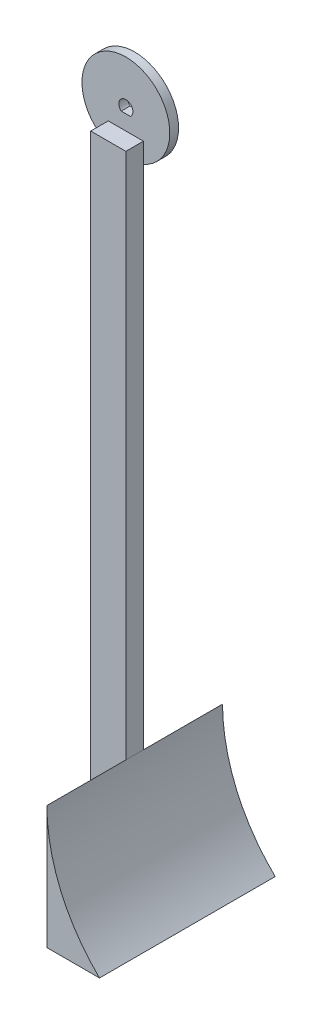
ISO-10303-21;
HEADER;
FILE_DESCRIPTION(('STEP AP214'),'2;1');
FILE_NAME('part.step','',(''),(''),'','','');
FILE_SCHEMA(('AUTOMOTIVE_DESIGN { 1 0 10303 214 1 1 1 1 }'));
ENDSEC;
DATA;
#1=APPLICATION_CONTEXT('core data for automotive mechanical design processes');
#2=APPLICATION_PROTOCOL_DEFINITION('international standard','automotive_design',2000,#1);
#3=PRODUCT_CONTEXT('',#1,'mechanical');
#4=PRODUCT('Part','Part','',(#3));
#5=PRODUCT_RELATED_PRODUCT_CATEGORY('part','',(#4));
#6=PRODUCT_DEFINITION_FORMATION('','',#4);
#7=PRODUCT_DEFINITION_CONTEXT('part definition',#1,'design');
#8=PRODUCT_DEFINITION('design','',#6,#7);
#9=PRODUCT_DEFINITION_SHAPE('','',#8);
#10=(LENGTH_UNIT() NAMED_UNIT(*) SI_UNIT(.MILLI.,.METRE.));
#11=(NAMED_UNIT(*) PLANE_ANGLE_UNIT() SI_UNIT($,.RADIAN.));
#12=(NAMED_UNIT(*) SI_UNIT($,.STERADIAN.) SOLID_ANGLE_UNIT());
#13=UNCERTAINTY_MEASURE_WITH_UNIT(LENGTH_MEASURE(1.E-05),#10,'distance_accuracy_value','');
#14=(GEOMETRIC_REPRESENTATION_CONTEXT(3) GLOBAL_UNCERTAINTY_ASSIGNED_CONTEXT((#13)) GLOBAL_UNIT_ASSIGNED_CONTEXT((#10,
#11,#12)) REPRESENTATION_CONTEXT('',''));
#15=CARTESIAN_POINT('',(0.,0.,0.));
#16=DIRECTION('',(0.,0.,1.));
#17=DIRECTION('',(1.,0.,0.));
#18=AXIS2_PLACEMENT_3D('',#15,#16,#17);
#19=CARTESIAN_POINT('',(5.,0.,0.));
#20=DIRECTION('',(1.,0.,0.));
#21=DIRECTION('',(0.,1.,0.));
#22=AXIS2_PLACEMENT_3D('',#19,#20,#21);
#23=PLANE('',#22);
#24=DIRECTION('',(0.,1.,0.));
#25=VECTOR('',#24,1.);
#26=CARTESIAN_POINT('',(5.,0.,7.5));
#27=LINE('',#26,#25);
#28=CARTESIAN_POINT('',(5.,-190.754430390358,7.5));
#29=VERTEX_POINT('',#28);
#30=CARTESIAN_POINT('',(5.00000000000002,-155.754430390358,7.49999999999999));
#31=VERTEX_POINT('',#30);
#32=EDGE_CURVE('E175',#29,#31,#27,.T.);
#33=ORIENTED_EDGE('',*,*,#32,.F.);
#34=DIRECTION('',(0.,0.,1.));
#35=VECTOR('',#34,1.);
#36=CARTESIAN_POINT('',(5.00000000000002,-190.754430390358,0.));
#37=LINE('',#36,#35);
#38=CARTESIAN_POINT('',(5.00000000000002,-190.754430390358,30.));
#39=VERTEX_POINT('',#38);
#40=EDGE_CURVE('E165',#29,#39,#37,.T.);
#41=ORIENTED_EDGE('',*,*,#40,.T.);
#42=DIRECTION('',(0.,-1.,0.));
#43=VECTOR('',#42,1.);
#44=CARTESIAN_POINT('',(5.,0.,30.));
#45=LINE('',#44,#43);
#46=CARTESIAN_POINT('',(5.00000000000002,-155.754430390358,30.));
#47=VERTEX_POINT('',#46);
#48=EDGE_CURVE('E308',#47,#39,#45,.T.);
#49=ORIENTED_EDGE('',*,*,#48,.F.);
#50=DIRECTION('',(0.,0.,-1.));
#51=VECTOR('',#50,1.);
#52=CARTESIAN_POINT('',(5.00000000000002,-155.754430390358,0.));
#53=LINE('',#52,#51);
#54=EDGE_CURVE('E155',#47,#31,#53,.T.);
#55=ORIENTED_EDGE('',*,*,#54,.T.);
#56=EDGE_LOOP('',(#33,#41,#49,#55));
#57=FACE_BOUND('',#56,.T.);
#58=ADVANCED_FACE('F47',(#57),#23,.F.);
#59=CARTESIAN_POINT('',(0.,0.,2.5));
#60=DIRECTION('',(0.,0.,-1.));
#61=DIRECTION('',(-1.,0.,0.));
#62=AXIS2_PLACEMENT_3D('',#59,#60,#61);
#63=CYLINDRICAL_SURFACE('',#62,2.);
#64=CARTESIAN_POINT('',(0.,0.,0.));
#65=DIRECTION('',(0.,0.,1.));
#66=DIRECTION('',(1.,0.,0.));
#67=AXIS2_PLACEMENT_3D('',#64,#65,#66);
#68=CIRCLE('',#67,2.);
#69=CARTESIAN_POINT('',(1.3228756555323,-1.5,0.));
#70=VERTEX_POINT('',#69);
#71=CARTESIAN_POINT('',(-1.3228756555323,-1.5,0.));
#72=VERTEX_POINT('',#71);
#73=EDGE_CURVE('E201',#70,#72,#68,.T.);
#74=ORIENTED_EDGE('',*,*,#73,.F.);
#75=DIRECTION('',(0.,0.,-1.));
#76=VECTOR('',#75,1.);
#77=CARTESIAN_POINT('',(1.3228756555323,-1.5,2.5));
#78=LINE('',#77,#76);
#79=CARTESIAN_POINT('',(1.3228756555323,-1.5,2.5));
#80=VERTEX_POINT('',#79);
#81=EDGE_CURVE('E51',#80,#70,#78,.T.);
#82=ORIENTED_EDGE('',*,*,#81,.F.);
#83=CARTESIAN_POINT('',(0.,0.,2.5));
#84=DIRECTION('',(0.,0.,1.));
#85=DIRECTION('',(1.,0.,0.));
#86=AXIS2_PLACEMENT_3D('',#83,#84,#85);
#87=CIRCLE('',#86,2.);
#88=CARTESIAN_POINT('',(-1.3228756555323,-1.5,2.5));
#89=VERTEX_POINT('',#88);
#90=EDGE_CURVE('E202',#80,#89,#87,.T.);
#91=ORIENTED_EDGE('',*,*,#90,.T.);
#92=DIRECTION('',(0.,0.,-1.));
#93=VECTOR('',#92,1.);
#94=CARTESIAN_POINT('',(-1.3228756555323,-1.5,2.5));
#95=LINE('',#94,#93);
#96=EDGE_CURVE('E216',#89,#72,#95,.T.);
#97=ORIENTED_EDGE('',*,*,#96,.T.);
#98=EDGE_LOOP('',(#74,#82,#91,#97));
#99=FACE_BOUND('',#98,.T.);
#100=ADVANCED_FACE('F49',(#99),#63,.F.);
#101=CARTESIAN_POINT('',(0.,-1.5,2.5));
#102=DIRECTION('',(0.,1.,0.));
#103=DIRECTION('',(0.,0.,1.));
#104=AXIS2_PLACEMENT_3D('',#101,#102,#103);
#105=PLANE('',#104);
#106=DIRECTION('',(1.,0.,0.));
#107=VECTOR('',#106,1.);
#108=CARTESIAN_POINT('',(0.,-1.5,0.));
#109=LINE('',#108,#107);
#110=EDGE_CURVE('E220',#72,#70,#109,.T.);
#111=ORIENTED_EDGE('',*,*,#110,.F.);
#112=ORIENTED_EDGE('',*,*,#96,.F.);
#113=DIRECTION('',(1.,0.,0.));
#114=VECTOR('',#113,1.);
#115=CARTESIAN_POINT('',(0.,-1.5,2.5));
#116=LINE('',#115,#114);
#117=EDGE_CURVE('E206',#89,#80,#116,.T.);
#118=ORIENTED_EDGE('',*,*,#117,.T.);
#119=ORIENTED_EDGE('',*,*,#81,.T.);
#120=EDGE_LOOP('',(#111,#112,#118,#119));
#121=FACE_BOUND('',#120,.T.);
#122=ADVANCED_FACE('F232',(#121),#105,.T.);
#123=CARTESIAN_POINT('',(0.,0.,2.5));
#124=DIRECTION('',(0.,0.,-1.));
#125=DIRECTION('',(-1.,0.,0.));
#126=AXIS2_PLACEMENT_3D('',#123,#124,#125);
#127=CYLINDRICAL_SURFACE('',#126,12.5);
#128=CARTESIAN_POINT('',(0.,0.,2.5));
#129=DIRECTION('',(0.,0.,1.));
#130=DIRECTION('',(1.,0.,0.));
#131=AXIS2_PLACEMENT_3D('',#128,#129,#130);
#132=CIRCLE('',#131,12.5);
#133=CARTESIAN_POINT('',(-5.,-11.4564392373896,2.5));
#134=VERTEX_POINT('',#133);
#135=CARTESIAN_POINT('',(5.,-11.4564392373896,2.5));
#136=VERTEX_POINT('',#135);
#137=EDGE_CURVE('E212',#134,#136,#132,.T.);
#138=ORIENTED_EDGE('',*,*,#137,.F.);
#139=EDGE_CURVE('E211',#136,#134,#132,.T.);
#140=ORIENTED_EDGE('',*,*,#139,.F.);
#141=EDGE_LOOP('',(#138,#140));
#142=FACE_BOUND('',#141,.T.);
#143=CARTESIAN_POINT('',(0.,0.,0.));
#144=DIRECTION('',(0.,0.,1.));
#145=DIRECTION('',(1.,0.,0.));
#146=AXIS2_PLACEMENT_3D('',#143,#144,#145);
#147=CIRCLE('',#146,12.5);
#148=CARTESIAN_POINT('',(12.5,0.,0.));
#149=VERTEX_POINT('',#148);
#150=EDGE_CURVE('E207',#149,#149,#147,.T.);
#151=ORIENTED_EDGE('',*,*,#150,.T.);
#152=EDGE_LOOP('',(#151));
#153=FACE_BOUND('',#152,.T.);
#154=ADVANCED_FACE('F244',(#142,#153),#127,.T.);
#155=CARTESIAN_POINT('',(0.,0.,2.5));
#156=DIRECTION('',(0.,0.,1.));
#157=DIRECTION('',(1.,0.,0.));
#158=AXIS2_PLACEMENT_3D('',#155,#156,#157);
#159=PLANE('',#158);
#160=DIRECTION('',(0.,-1.,0.));
#161=VECTOR('',#160,1.);
#162=CARTESIAN_POINT('',(-5.,0.,2.5));
#163=LINE('',#162,#161);
#164=CARTESIAN_POINT('',(-5.,-5.75443039035809,2.5));
#165=VERTEX_POINT('',#164);
#166=EDGE_CURVE('E73',#165,#134,#163,.T.);
#167=ORIENTED_EDGE('',*,*,#166,.F.);
#168=DIRECTION('',(1.,0.,0.));
#169=VECTOR('',#168,1.);
#170=CARTESIAN_POINT('',(0.,-5.75443039035809,2.5));
#171=LINE('',#170,#169);
#172=CARTESIAN_POINT('',(5.,-5.75443039035809,2.5));
#173=VERTEX_POINT('',#172);
#174=EDGE_CURVE('E189',#165,#173,#171,.T.);
#175=ORIENTED_EDGE('',*,*,#174,.T.);
#176=DIRECTION('',(0.,1.,0.));
#177=VECTOR('',#176,1.);
#178=CARTESIAN_POINT('',(5.,0.,2.5));
#179=LINE('',#178,#177);
#180=EDGE_CURVE('E11',#136,#173,#179,.T.);
#181=ORIENTED_EDGE('',*,*,#180,.F.);
#182=ORIENTED_EDGE('',*,*,#139,.T.);
#183=EDGE_LOOP('',(#167,#175,#181,#182));
#184=FACE_BOUND('',#183,.T.);
#185=ORIENTED_EDGE('',*,*,#90,.F.);
#186=ORIENTED_EDGE('',*,*,#117,.F.);
#187=EDGE_LOOP('',(#185,#186));
#188=FACE_BOUND('',#187,.T.);
#189=ADVANCED_FACE('F240',(#184,#188),#159,.T.);
#190=CARTESIAN_POINT('',(0.,0.,0.));
#191=DIRECTION('',(0.,0.,1.));
#192=DIRECTION('',(1.,0.,0.));
#193=AXIS2_PLACEMENT_3D('',#190,#191,#192);
#194=PLANE('',#193);
#195=ORIENTED_EDGE('',*,*,#73,.T.);
#196=ORIENTED_EDGE('',*,*,#110,.T.);
#197=EDGE_LOOP('',(#195,#196));
#198=FACE_BOUND('',#197,.T.);
#199=ORIENTED_EDGE('',*,*,#150,.F.);
#200=EDGE_LOOP('',(#199));
#201=FACE_BOUND('',#200,.T.);
#202=ADVANCED_FACE('F236',(#198,#201),#194,.F.);
#203=CARTESIAN_POINT('',(0.,0.,2.5));
#204=DIRECTION('',(0.,0.,1.));
#205=DIRECTION('',(1.,0.,0.));
#206=AXIS2_PLACEMENT_3D('',#203,#204,#205);
#207=PLANE('',#206);
#208=CARTESIAN_POINT('',(-4.99999999999998,-190.754430390358,2.5));
#209=VERTEX_POINT('',#208);
#210=EDGE_CURVE('E192',#134,#209,#163,.T.);
#211=ORIENTED_EDGE('',*,*,#210,.F.);
#212=ORIENTED_EDGE('',*,*,#137,.T.);
#213=CARTESIAN_POINT('',(5.00000000000002,-155.754430390358,2.5));
#214=VERTEX_POINT('',#213);
#215=EDGE_CURVE('E59',#214,#136,#179,.T.);
#216=ORIENTED_EDGE('',*,*,#215,.F.);
#217=CARTESIAN_POINT('',(5.00000000000002,-190.754430390358,2.5));
#218=VERTEX_POINT('',#217);
#219=EDGE_CURVE('E58',#218,#214,#179,.T.);
#220=ORIENTED_EDGE('',*,*,#219,.F.);
#221=DIRECTION('',(-1.,0.,0.));
#222=VECTOR('',#221,1.);
#223=CARTESIAN_POINT('',(5.,-190.754430390358,2.5));
#224=LINE('',#223,#222);
#225=EDGE_CURVE('E313',#218,#209,#224,.T.);
#226=ORIENTED_EDGE('',*,*,#225,.T.);
#227=EDGE_LOOP('',(#211,#212,#216,#220,#226));
#228=FACE_BOUND('',#227,.T.);
#229=ADVANCED_FACE('F239',(#228),#207,.F.);
#230=CARTESIAN_POINT('',(5.,0.,7.5));
#231=DIRECTION('',(-1.,0.,0.));
#232=DIRECTION('',(0.,-1.,0.));
#233=AXIS2_PLACEMENT_3D('',#230,#231,#232);
#234=PLANE('',#233);
#235=CARTESIAN_POINT('',(5.,-5.75443039035809,7.5));
#236=VERTEX_POINT('',#235);
#237=EDGE_CURVE('E180',#31,#236,#27,.T.);
#238=ORIENTED_EDGE('',*,*,#237,.F.);
#239=EDGE_CURVE('E152',#31,#214,#53,.T.);
#240=ORIENTED_EDGE('',*,*,#239,.T.);
#241=ORIENTED_EDGE('',*,*,#215,.T.);
#242=ORIENTED_EDGE('',*,*,#180,.T.);
#243=DIRECTION('',(0.,0.,-1.));
#244=VECTOR('',#243,1.);
#245=CARTESIAN_POINT('',(5.,-5.75443039035809,7.5));
#246=LINE('',#245,#244);
#247=EDGE_CURVE('E197',#236,#173,#246,.T.);
#248=ORIENTED_EDGE('',*,*,#247,.F.);
#249=EDGE_LOOP('',(#238,#240,#241,#242,#248));
#250=FACE_BOUND('',#249,.T.);
#251=ADVANCED_FACE('F285',(#250),#234,.F.);
#252=CARTESIAN_POINT('',(0.,-5.75443039035809,7.5));
#253=DIRECTION('',(0.,1.,0.));
#254=DIRECTION('',(0.,0.,1.));
#255=AXIS2_PLACEMENT_3D('',#252,#253,#254);
#256=PLANE('',#255);
#257=ORIENTED_EDGE('',*,*,#174,.F.);
#258=DIRECTION('',(0.,0.,-1.));
#259=VECTOR('',#258,1.);
#260=CARTESIAN_POINT('',(-5.,-5.75443039035809,7.5));
#261=LINE('',#260,#259);
#262=CARTESIAN_POINT('',(-5.,-5.75443039035809,7.5));
#263=VERTEX_POINT('',#262);
#264=EDGE_CURVE('E186',#263,#165,#261,.T.);
#265=ORIENTED_EDGE('',*,*,#264,.F.);
#266=DIRECTION('',(1.,0.,0.));
#267=VECTOR('',#266,1.);
#268=CARTESIAN_POINT('',(0.,-5.75443039035809,7.5));
#269=LINE('',#268,#267);
#270=EDGE_CURVE('E179',#263,#236,#269,.T.);
#271=ORIENTED_EDGE('',*,*,#270,.T.);
#272=ORIENTED_EDGE('',*,*,#247,.T.);
#273=EDGE_LOOP('',(#257,#265,#271,#272));
#274=FACE_BOUND('',#273,.T.);
#275=ADVANCED_FACE('F280',(#274),#256,.T.);
#276=CARTESIAN_POINT('',(-5.,0.,7.5));
#277=DIRECTION('',(1.,0.,0.));
#278=DIRECTION('',(0.,1.,0.));
#279=AXIS2_PLACEMENT_3D('',#276,#277,#278);
#280=PLANE('',#279);
#281=ORIENTED_EDGE('',*,*,#166,.T.);
#282=ORIENTED_EDGE('',*,*,#210,.T.);
#283=DIRECTION('',(0.,0.,1.));
#284=VECTOR('',#283,1.);
#285=CARTESIAN_POINT('',(-4.99999999999998,-190.754430390358,2.5));
#286=LINE('',#285,#284);
#287=CARTESIAN_POINT('',(-4.99999999999998,-190.754430390358,7.5));
#288=VERTEX_POINT('',#287);
#289=EDGE_CURVE('E316',#209,#288,#286,.T.);
#290=ORIENTED_EDGE('',*,*,#289,.T.);
#291=DIRECTION('',(0.,-1.,0.));
#292=VECTOR('',#291,1.);
#293=CARTESIAN_POINT('',(-5.,0.,7.5));
#294=LINE('',#293,#292);
#295=EDGE_CURVE('E184',#263,#288,#294,.T.);
#296=ORIENTED_EDGE('',*,*,#295,.F.);
#297=ORIENTED_EDGE('',*,*,#264,.T.);
#298=EDGE_LOOP('',(#281,#282,#290,#296,#297));
#299=FACE_BOUND('',#298,.T.);
#300=ADVANCED_FACE('F274',(#299),#280,.F.);
#301=CARTESIAN_POINT('',(0.,0.,7.5));
#302=DIRECTION('',(0.,0.,1.));
#303=DIRECTION('',(1.,0.,0.));
#304=AXIS2_PLACEMENT_3D('',#301,#302,#303);
#305=PLANE('',#304);
#306=ORIENTED_EDGE('',*,*,#295,.T.);
#307=DIRECTION('',(-1.,0.,0.));
#308=VECTOR('',#307,1.);
#309=CARTESIAN_POINT('',(5.,-190.754430390358,7.5));
#310=LINE('',#309,#308);
#311=EDGE_CURVE('E153',#29,#288,#310,.T.);
#312=ORIENTED_EDGE('',*,*,#311,.F.);
#313=ORIENTED_EDGE('',*,*,#32,.T.);
#314=ORIENTED_EDGE('',*,*,#237,.T.);
#315=ORIENTED_EDGE('',*,*,#270,.F.);
#316=EDGE_LOOP('',(#306,#312,#313,#314,#315));
#317=FACE_BOUND('',#316,.T.);
#318=ADVANCED_FACE('F266',(#317),#305,.T.);
#319=CARTESIAN_POINT('',(5.00000000000002,-190.754430390358,-20.));
#320=VERTEX_POINT('',#319);
#321=EDGE_CURVE('E160',#320,#218,#37,.T.);
#322=ORIENTED_EDGE('',*,*,#321,.T.);
#323=ORIENTED_EDGE('',*,*,#219,.T.);
#324=CARTESIAN_POINT('',(5.00000000000002,-155.754430390358,-20.));
#325=VERTEX_POINT('',#324);
#326=EDGE_CURVE('E137',#214,#325,#53,.T.);
#327=ORIENTED_EDGE('',*,*,#326,.T.);
#328=DIRECTION('',(0.,-1.,0.));
#329=VECTOR('',#328,1.);
#330=CARTESIAN_POINT('',(5.,0.,-20.));
#331=LINE('',#330,#329);
#332=EDGE_CURVE('E149',#325,#320,#331,.T.);
#333=ORIENTED_EDGE('',*,*,#332,.T.);
#334=EDGE_LOOP('',(#322,#323,#327,#333));
#335=FACE_BOUND('',#334,.T.);
#336=ADVANCED_FACE('F148',(#335),#23,.F.);
#337=CARTESIAN_POINT('',(20.,0.,30.));
#338=DIRECTION('',(0.,0.,-1.));
#339=DIRECTION('',(0.,1.,0.));
#340=AXIS2_PLACEMENT_3D('',#337,#338,#339);
#341=PLANE('',#340);
#342=DIRECTION('',(-1.,0.,0.));
#343=VECTOR('',#342,1.);
#344=CARTESIAN_POINT('',(20.,-190.754430390358,30.));
#345=LINE('',#344,#343);
#346=CARTESIAN_POINT('',(20.,-190.754430390358,30.));
#347=VERTEX_POINT('',#346);
#348=EDGE_CURVE('E171',#347,#39,#345,.T.);
#349=ORIENTED_EDGE('',*,*,#348,.F.);
#350=CARTESIAN_POINT('',(54.0318899837118,-155.455048968767,30.));
#351=DIRECTION('',(0.,0.,-1.));
#352=DIRECTION('',(0.,1.,0.));
#353=AXIS2_PLACEMENT_3D('',#350,#351,#352);
#354=CIRCLE('',#353,49.0328039643911);
#355=EDGE_CURVE('E144',#347,#47,#354,.T.);
#356=ORIENTED_EDGE('',*,*,#355,.T.);
#357=ORIENTED_EDGE('',*,*,#48,.T.);
#358=EDGE_LOOP('',(#349,#356,#357));
#359=FACE_BOUND('',#358,.T.);
#360=ADVANCED_FACE('F265',(#359),#341,.F.);
#361=CARTESIAN_POINT('',(20.,-190.754430390358,0.));
#362=DIRECTION('',(0.,-1.,0.));
#363=DIRECTION('',(1.,0.,0.));
#364=AXIS2_PLACEMENT_3D('',#361,#362,#363);
#365=PLANE('',#364);
#366=ORIENTED_EDGE('',*,*,#321,.F.);
#367=DIRECTION('',(-1.,0.,0.));
#368=VECTOR('',#367,1.);
#369=CARTESIAN_POINT('',(20.,-190.754430390358,-20.));
#370=LINE('',#369,#368);
#371=CARTESIAN_POINT('',(20.,-190.754430390358,-20.));
#372=VERTEX_POINT('',#371);
#373=EDGE_CURVE('E157',#372,#320,#370,.T.);
#374=ORIENTED_EDGE('',*,*,#373,.F.);
#375=DIRECTION('',(0.,0.,1.));
#376=VECTOR('',#375,1.);
#377=CARTESIAN_POINT('',(20.,-190.754430390358,0.));
#378=LINE('',#377,#376);
#379=EDGE_CURVE('E139',#372,#347,#378,.T.);
#380=ORIENTED_EDGE('',*,*,#379,.T.);
#381=ORIENTED_EDGE('',*,*,#348,.T.);
#382=ORIENTED_EDGE('',*,*,#40,.F.);
#383=ORIENTED_EDGE('',*,*,#311,.T.);
#384=ORIENTED_EDGE('',*,*,#289,.F.);
#385=ORIENTED_EDGE('',*,*,#225,.F.);
#386=EDGE_LOOP('',(#366,#374,#380,#381,#382,#383,#384,#385));
#387=FACE_BOUND('',#386,.T.);
#388=ADVANCED_FACE('F271',(#387),#365,.T.);
#389=CARTESIAN_POINT('',(20.,0.,-20.));
#390=DIRECTION('',(0.,0.,-1.));
#391=DIRECTION('',(0.,1.,0.));
#392=AXIS2_PLACEMENT_3D('',#389,#390,#391);
#393=PLANE('',#392);
#394=CARTESIAN_POINT('',(54.0318899837118,-155.455048968767,-20.));
#395=DIRECTION('',(0.,0.,-1.));
#396=DIRECTION('',(0.,-1.,0.));
#397=AXIS2_PLACEMENT_3D('',#394,#395,#396);
#398=CIRCLE('',#397,49.0328039643911);
#399=EDGE_CURVE('E134',#372,#325,#398,.T.);
#400=ORIENTED_EDGE('',*,*,#399,.F.);
#401=ORIENTED_EDGE('',*,*,#373,.T.);
#402=ORIENTED_EDGE('',*,*,#332,.F.);
#403=EDGE_LOOP('',(#400,#401,#402));
#404=FACE_BOUND('',#403,.T.);
#405=ADVANCED_FACE('F156',(#404),#393,.T.);
#406=CARTESIAN_POINT('',(54.0318899837118,-155.455048968767,122.));
#407=DIRECTION('',(0.,0.,-1.));
#408=DIRECTION('',(0.,1.,0.));
#409=AXIS2_PLACEMENT_3D('',#406,#407,#408);
#410=CYLINDRICAL_SURFACE('',#409,49.0328039643911);
#411=ORIENTED_EDGE('',*,*,#379,.F.);
#412=ORIENTED_EDGE('',*,*,#399,.T.);
#413=ORIENTED_EDGE('',*,*,#326,.F.);
#414=ORIENTED_EDGE('',*,*,#239,.F.);
#415=ORIENTED_EDGE('',*,*,#54,.F.);
#416=ORIENTED_EDGE('',*,*,#355,.F.);
#417=EDGE_LOOP('',(#411,#412,#413,#414,#415,#416));
#418=FACE_BOUND('',#417,.T.);
#419=ADVANCED_FACE('F136',(#418),#410,.F.);
#420=CLOSED_SHELL('',(#58,#100,#122,#154,#189,#202,#229,#251,#275,#300,#318,#336,#360,#388,#405,#419));
#421=MANIFOLD_SOLID_BREP('B2',#420);
#422=ADVANCED_BREP_SHAPE_REPRESENTATION('',(#18,#421),#14);
#423=SHAPE_DEFINITION_REPRESENTATION(#9,#422);
ENDSEC;
END-ISO-10303-21;
